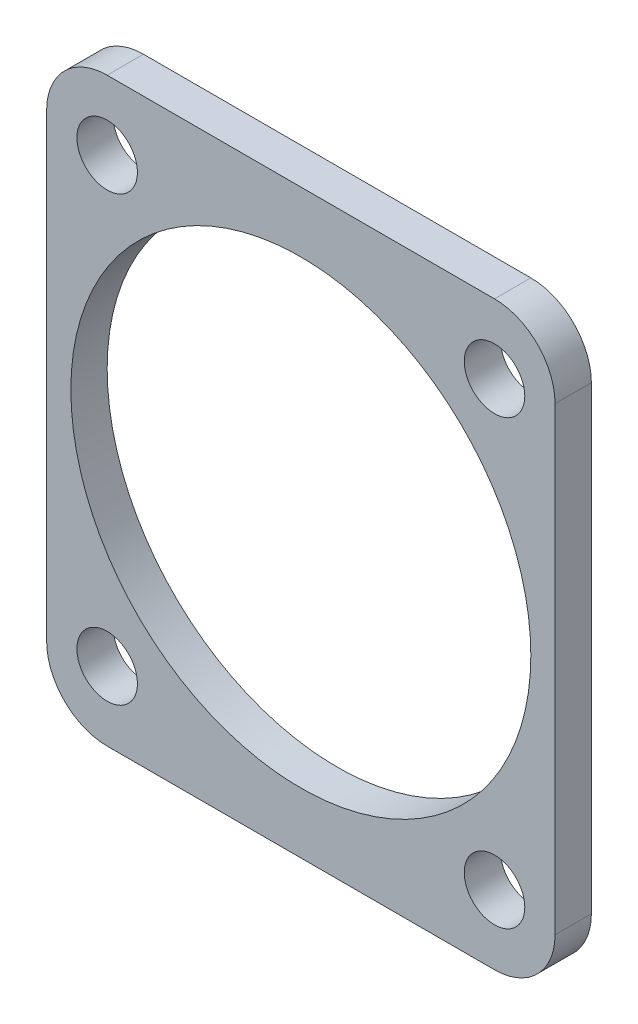
ISO-10303-21;
HEADER;
FILE_DESCRIPTION(('STEP AP214'),'2;1');
FILE_NAME('part.step','',(''),(''),'','','');
FILE_SCHEMA(('AUTOMOTIVE_DESIGN { 1 0 10303 214 1 1 1 1 }'));
ENDSEC;
DATA;
#1=APPLICATION_CONTEXT('core data for automotive mechanical design processes');
#2=APPLICATION_PROTOCOL_DEFINITION('international standard','automotive_design',2000,#1);
#3=PRODUCT_CONTEXT('',#1,'mechanical');
#4=PRODUCT('Part','Part','',(#3));
#5=PRODUCT_RELATED_PRODUCT_CATEGORY('part','',(#4));
#6=PRODUCT_DEFINITION_FORMATION('','',#4);
#7=PRODUCT_DEFINITION_CONTEXT('part definition',#1,'design');
#8=PRODUCT_DEFINITION('design','',#6,#7);
#9=PRODUCT_DEFINITION_SHAPE('','',#8);
#10=(LENGTH_UNIT() NAMED_UNIT(*) SI_UNIT(.MILLI.,.METRE.));
#11=(NAMED_UNIT(*) PLANE_ANGLE_UNIT() SI_UNIT($,.RADIAN.));
#12=(NAMED_UNIT(*) SI_UNIT($,.STERADIAN.) SOLID_ANGLE_UNIT());
#13=UNCERTAINTY_MEASURE_WITH_UNIT(LENGTH_MEASURE(1.E-05),#10,'distance_accuracy_value','');
#14=(GEOMETRIC_REPRESENTATION_CONTEXT(3) GLOBAL_UNCERTAINTY_ASSIGNED_CONTEXT((#13)) GLOBAL_UNIT_ASSIGNED_CONTEXT((#10,
#11,#12)) REPRESENTATION_CONTEXT('',''));
#15=CARTESIAN_POINT('',(0.,0.,0.));
#16=DIRECTION('',(0.,0.,1.));
#17=DIRECTION('',(1.,0.,0.));
#18=AXIS2_PLACEMENT_3D('',#15,#16,#17);
#19=CARTESIAN_POINT('',(0.,0.,3.));
#20=DIRECTION('',(0.,0.,-1.));
#21=DIRECTION('',(-1.,0.,0.));
#22=AXIS2_PLACEMENT_3D('',#19,#20,#21);
#23=PLANE('',#22);
#24=DIRECTION('',(1.,0.,0.));
#25=VECTOR('',#24,1.);
#26=CARTESIAN_POINT('',(-21.,-24.,3.));
#27=LINE('',#26,#25);
#28=CARTESIAN_POINT('',(-16.,-24.,3.));
#29=VERTEX_POINT('',#28);
#30=CARTESIAN_POINT('',(16.,-24.,3.));
#31=VERTEX_POINT('',#30);
#32=EDGE_CURVE('E152',#29,#31,#27,.T.);
#33=ORIENTED_EDGE('',*,*,#32,.T.);
#34=CARTESIAN_POINT('',(16.,-19.,3.));
#35=DIRECTION('',(0.,0.,-1.));
#36=DIRECTION('',(-1.,0.,0.));
#37=AXIS2_PLACEMENT_3D('',#34,#35,#36);
#38=CIRCLE('',#37,5.);
#39=CARTESIAN_POINT('',(21.,-19.,3.));
#40=VERTEX_POINT('',#39);
#41=EDGE_CURVE('E182',#31,#40,#38,.F.);
#42=ORIENTED_EDGE('',*,*,#41,.T.);
#43=DIRECTION('',(0.,1.,0.));
#44=VECTOR('',#43,1.);
#45=CARTESIAN_POINT('',(21.,-24.,3.));
#46=LINE('',#45,#44);
#47=CARTESIAN_POINT('',(21.,19.,3.));
#48=VERTEX_POINT('',#47);
#49=EDGE_CURVE('E131',#40,#48,#46,.T.);
#50=ORIENTED_EDGE('',*,*,#49,.T.);
#51=CARTESIAN_POINT('',(16.,19.,3.));
#52=DIRECTION('',(0.,0.,-1.));
#53=DIRECTION('',(-1.,0.,0.));
#54=AXIS2_PLACEMENT_3D('',#51,#52,#53);
#55=CIRCLE('',#54,5.);
#56=CARTESIAN_POINT('',(16.,24.,3.));
#57=VERTEX_POINT('',#56);
#58=EDGE_CURVE('E174',#48,#57,#55,.F.);
#59=ORIENTED_EDGE('',*,*,#58,.T.);
#60=DIRECTION('',(-1.,0.,0.));
#61=VECTOR('',#60,1.);
#62=CARTESIAN_POINT('',(-21.,24.,3.));
#63=LINE('',#62,#61);
#64=CARTESIAN_POINT('',(-16.,24.,3.));
#65=VERTEX_POINT('',#64);
#66=EDGE_CURVE('E197',#57,#65,#63,.T.);
#67=ORIENTED_EDGE('',*,*,#66,.T.);
#68=CARTESIAN_POINT('',(-16.,19.,3.));
#69=DIRECTION('',(0.,0.,-1.));
#70=DIRECTION('',(-1.,0.,0.));
#71=AXIS2_PLACEMENT_3D('',#68,#69,#70);
#72=CIRCLE('',#71,5.);
#73=CARTESIAN_POINT('',(-21.,19.,3.));
#74=VERTEX_POINT('',#73);
#75=EDGE_CURVE('E66',#65,#74,#72,.F.);
#76=ORIENTED_EDGE('',*,*,#75,.T.);
#77=DIRECTION('',(0.,-1.,0.));
#78=VECTOR('',#77,1.);
#79=CARTESIAN_POINT('',(-21.,-24.,3.));
#80=LINE('',#79,#78);
#81=CARTESIAN_POINT('',(-21.,-19.,3.));
#82=VERTEX_POINT('',#81);
#83=EDGE_CURVE('E205',#74,#82,#80,.T.);
#84=ORIENTED_EDGE('',*,*,#83,.T.);
#85=CARTESIAN_POINT('',(-16.,-19.,3.));
#86=DIRECTION('',(0.,0.,-1.));
#87=DIRECTION('',(-1.,0.,0.));
#88=AXIS2_PLACEMENT_3D('',#85,#86,#87);
#89=CIRCLE('',#88,5.);
#90=EDGE_CURVE('E179',#82,#29,#89,.F.);
#91=ORIENTED_EDGE('',*,*,#90,.T.);
#92=EDGE_LOOP('',(#33,#42,#50,#59,#67,#76,#84,#91));
#93=FACE_BOUND('',#92,.T.);
#94=CARTESIAN_POINT('',(0.,0.,3.));
#95=DIRECTION('',(0.,0.,1.));
#96=DIRECTION('',(1.,0.,0.));
#97=AXIS2_PLACEMENT_3D('',#94,#95,#96);
#98=CIRCLE('',#97,19.);
#99=CARTESIAN_POINT('',(19.,0.,3.));
#100=VERTEX_POINT('',#99);
#101=EDGE_CURVE('E141',#100,#100,#98,.T.);
#102=ORIENTED_EDGE('',*,*,#101,.F.);
#103=EDGE_LOOP('',(#102));
#104=FACE_BOUND('',#103,.T.);
#105=CARTESIAN_POINT('',(-16.,18.2857142857143,3.));
#106=DIRECTION('',(0.,0.,1.));
#107=DIRECTION('',(1.,0.,0.));
#108=AXIS2_PLACEMENT_3D('',#105,#106,#107);
#109=CIRCLE('',#108,2.5);
#110=CARTESIAN_POINT('',(-13.5,18.2857142857143,3.));
#111=VERTEX_POINT('',#110);
#112=EDGE_CURVE('E217',#111,#111,#109,.T.);
#113=ORIENTED_EDGE('',*,*,#112,.F.);
#114=EDGE_LOOP('',(#113));
#115=FACE_BOUND('',#114,.T.);
#116=CARTESIAN_POINT('',(16.,18.2857142857143,3.));
#117=DIRECTION('',(0.,0.,1.));
#118=DIRECTION('',(1.,0.,0.));
#119=AXIS2_PLACEMENT_3D('',#116,#117,#118);
#120=CIRCLE('',#119,2.5);
#121=CARTESIAN_POINT('',(18.5,18.2857142857143,3.));
#122=VERTEX_POINT('',#121);
#123=EDGE_CURVE('E223',#122,#122,#120,.T.);
#124=ORIENTED_EDGE('',*,*,#123,.F.);
#125=EDGE_LOOP('',(#124));
#126=FACE_BOUND('',#125,.T.);
#127=CARTESIAN_POINT('',(16.,-18.2857142857143,3.));
#128=DIRECTION('',(0.,0.,1.));
#129=DIRECTION('',(1.,0.,0.));
#130=AXIS2_PLACEMENT_3D('',#127,#128,#129);
#131=CIRCLE('',#130,2.5);
#132=CARTESIAN_POINT('',(18.5,-18.2857142857143,3.));
#133=VERTEX_POINT('',#132);
#134=EDGE_CURVE('E231',#133,#133,#131,.T.);
#135=ORIENTED_EDGE('',*,*,#134,.F.);
#136=EDGE_LOOP('',(#135));
#137=FACE_BOUND('',#136,.T.);
#138=CARTESIAN_POINT('',(-16.,-18.2857142857143,3.));
#139=DIRECTION('',(0.,0.,1.));
#140=DIRECTION('',(1.,0.,0.));
#141=AXIS2_PLACEMENT_3D('',#138,#139,#140);
#142=CIRCLE('',#141,2.5);
#143=CARTESIAN_POINT('',(-13.5,-18.2857142857143,3.));
#144=VERTEX_POINT('',#143);
#145=EDGE_CURVE('E239',#144,#144,#142,.T.);
#146=ORIENTED_EDGE('',*,*,#145,.F.);
#147=EDGE_LOOP('',(#146));
#148=FACE_BOUND('',#147,.T.);
#149=ADVANCED_FACE('F43',(#93,#104,#115,#126,#137,#148),#23,.F.);
#150=CARTESIAN_POINT('',(0.,0.,0.));
#151=DIRECTION('',(0.,0.,-1.));
#152=DIRECTION('',(-1.,0.,0.));
#153=AXIS2_PLACEMENT_3D('',#150,#151,#152);
#154=PLANE('',#153);
#155=CARTESIAN_POINT('',(16.,-18.2857142857143,0.));
#156=DIRECTION('',(0.,0.,1.));
#157=DIRECTION('',(1.,0.,0.));
#158=AXIS2_PLACEMENT_3D('',#155,#156,#157);
#159=CIRCLE('',#158,2.5);
#160=CARTESIAN_POINT('',(18.5,-18.2857142857143,0.));
#161=VERTEX_POINT('',#160);
#162=EDGE_CURVE('E235',#161,#161,#159,.T.);
#163=ORIENTED_EDGE('',*,*,#162,.T.);
#164=EDGE_LOOP('',(#163));
#165=FACE_BOUND('',#164,.T.);
#166=CARTESIAN_POINT('',(-16.,18.2857142857143,0.));
#167=DIRECTION('',(0.,0.,1.));
#168=DIRECTION('',(1.,0.,0.));
#169=AXIS2_PLACEMENT_3D('',#166,#167,#168);
#170=CIRCLE('',#169,2.5);
#171=CARTESIAN_POINT('',(-13.5,18.2857142857143,0.));
#172=VERTEX_POINT('',#171);
#173=EDGE_CURVE('E219',#172,#172,#170,.T.);
#174=ORIENTED_EDGE('',*,*,#173,.T.);
#175=EDGE_LOOP('',(#174));
#176=FACE_BOUND('',#175,.T.);
#177=DIRECTION('',(0.,1.,0.));
#178=VECTOR('',#177,1.);
#179=CARTESIAN_POINT('',(21.,-24.,0.));
#180=LINE('',#179,#178);
#181=CARTESIAN_POINT('',(21.,-19.,0.));
#182=VERTEX_POINT('',#181);
#183=CARTESIAN_POINT('',(21.,19.,0.));
#184=VERTEX_POINT('',#183);
#185=EDGE_CURVE('E128',#182,#184,#180,.T.);
#186=ORIENTED_EDGE('',*,*,#185,.F.);
#187=CARTESIAN_POINT('',(16.,-19.,0.));
#188=DIRECTION('',(0.,0.,-1.));
#189=DIRECTION('',(-1.,0.,0.));
#190=AXIS2_PLACEMENT_3D('',#187,#188,#189);
#191=CIRCLE('',#190,5.);
#192=CARTESIAN_POINT('',(16.,-24.,0.));
#193=VERTEX_POINT('',#192);
#194=EDGE_CURVE('E110',#182,#193,#191,.T.);
#195=ORIENTED_EDGE('',*,*,#194,.T.);
#196=DIRECTION('',(1.,0.,0.));
#197=VECTOR('',#196,1.);
#198=CARTESIAN_POINT('',(-21.,-24.,0.));
#199=LINE('',#198,#197);
#200=CARTESIAN_POINT('',(-16.,-24.,0.));
#201=VERTEX_POINT('',#200);
#202=EDGE_CURVE('E157',#201,#193,#199,.T.);
#203=ORIENTED_EDGE('',*,*,#202,.F.);
#204=CARTESIAN_POINT('',(-16.,-19.,0.));
#205=DIRECTION('',(0.,0.,-1.));
#206=DIRECTION('',(-1.,0.,0.));
#207=AXIS2_PLACEMENT_3D('',#204,#205,#206);
#208=CIRCLE('',#207,5.);
#209=CARTESIAN_POINT('',(-21.,-19.,0.));
#210=VERTEX_POINT('',#209);
#211=EDGE_CURVE('E122',#201,#210,#208,.T.);
#212=ORIENTED_EDGE('',*,*,#211,.T.);
#213=DIRECTION('',(0.,-1.,0.));
#214=VECTOR('',#213,1.);
#215=CARTESIAN_POINT('',(-21.,-24.,0.));
#216=LINE('',#215,#214);
#217=CARTESIAN_POINT('',(-21.,19.,0.));
#218=VERTEX_POINT('',#217);
#219=EDGE_CURVE('E146',#218,#210,#216,.T.);
#220=ORIENTED_EDGE('',*,*,#219,.F.);
#221=CARTESIAN_POINT('',(-16.,19.,0.));
#222=DIRECTION('',(0.,0.,-1.));
#223=DIRECTION('',(-1.,0.,0.));
#224=AXIS2_PLACEMENT_3D('',#221,#222,#223);
#225=CIRCLE('',#224,5.);
#226=CARTESIAN_POINT('',(-16.,24.,0.));
#227=VERTEX_POINT('',#226);
#228=EDGE_CURVE('E164',#218,#227,#225,.T.);
#229=ORIENTED_EDGE('',*,*,#228,.T.);
#230=DIRECTION('',(-1.,0.,0.));
#231=VECTOR('',#230,1.);
#232=CARTESIAN_POINT('',(-21.,24.,0.));
#233=LINE('',#232,#231);
#234=CARTESIAN_POINT('',(16.,24.,0.));
#235=VERTEX_POINT('',#234);
#236=EDGE_CURVE('E140',#235,#227,#233,.T.);
#237=ORIENTED_EDGE('',*,*,#236,.F.);
#238=CARTESIAN_POINT('',(16.,19.,0.));
#239=DIRECTION('',(0.,0.,-1.));
#240=DIRECTION('',(-1.,0.,0.));
#241=AXIS2_PLACEMENT_3D('',#238,#239,#240);
#242=CIRCLE('',#241,5.);
#243=EDGE_CURVE('E133',#235,#184,#242,.T.);
#244=ORIENTED_EDGE('',*,*,#243,.T.);
#245=EDGE_LOOP('',(#186,#195,#203,#212,#220,#229,#237,#244));
#246=FACE_BOUND('',#245,.T.);
#247=CARTESIAN_POINT('',(0.,0.,0.));
#248=DIRECTION('',(0.,0.,1.));
#249=DIRECTION('',(1.,0.,0.));
#250=AXIS2_PLACEMENT_3D('',#247,#248,#249);
#251=CIRCLE('',#250,19.);
#252=CARTESIAN_POINT('',(19.,0.,0.));
#253=VERTEX_POINT('',#252);
#254=EDGE_CURVE('E149',#253,#253,#251,.T.);
#255=ORIENTED_EDGE('',*,*,#254,.T.);
#256=EDGE_LOOP('',(#255));
#257=FACE_BOUND('',#256,.T.);
#258=CARTESIAN_POINT('',(16.,18.2857142857143,0.));
#259=DIRECTION('',(0.,0.,1.));
#260=DIRECTION('',(1.,0.,0.));
#261=AXIS2_PLACEMENT_3D('',#258,#259,#260);
#262=CIRCLE('',#261,2.5);
#263=CARTESIAN_POINT('',(18.5,18.2857142857143,0.));
#264=VERTEX_POINT('',#263);
#265=EDGE_CURVE('E227',#264,#264,#262,.T.);
#266=ORIENTED_EDGE('',*,*,#265,.T.);
#267=EDGE_LOOP('',(#266));
#268=FACE_BOUND('',#267,.T.);
#269=CARTESIAN_POINT('',(-16.,-18.2857142857143,0.));
#270=DIRECTION('',(0.,0.,1.));
#271=DIRECTION('',(1.,0.,0.));
#272=AXIS2_PLACEMENT_3D('',#269,#270,#271);
#273=CIRCLE('',#272,2.5);
#274=CARTESIAN_POINT('',(-13.5,-18.2857142857143,0.));
#275=VERTEX_POINT('',#274);
#276=EDGE_CURVE('E243',#275,#275,#273,.T.);
#277=ORIENTED_EDGE('',*,*,#276,.T.);
#278=EDGE_LOOP('',(#277));
#279=FACE_BOUND('',#278,.T.);
#280=ADVANCED_FACE('F136',(#165,#176,#246,#257,#268,#279),#154,.T.);
#281=CARTESIAN_POINT('',(21.,-24.,3.));
#282=DIRECTION('',(-1.,0.,0.));
#283=DIRECTION('',(0.,0.,1.));
#284=AXIS2_PLACEMENT_3D('',#281,#282,#283);
#285=PLANE('',#284);
#286=ORIENTED_EDGE('',*,*,#49,.F.);
#287=DIRECTION('',(0.,0.,-1.));
#288=VECTOR('',#287,1.);
#289=CARTESIAN_POINT('',(21.,-19.,3.));
#290=LINE('',#289,#288);
#291=EDGE_CURVE('E114',#40,#182,#290,.T.);
#292=ORIENTED_EDGE('',*,*,#291,.T.);
#293=ORIENTED_EDGE('',*,*,#185,.T.);
#294=DIRECTION('',(0.,0.,-1.));
#295=VECTOR('',#294,1.);
#296=CARTESIAN_POINT('',(21.,19.,3.));
#297=LINE('',#296,#295);
#298=EDGE_CURVE('E134',#184,#48,#297,.F.);
#299=ORIENTED_EDGE('',*,*,#298,.T.);
#300=EDGE_LOOP('',(#286,#292,#293,#299));
#301=FACE_BOUND('',#300,.T.);
#302=ADVANCED_FACE('F127',(#301),#285,.F.);
#303=CARTESIAN_POINT('',(-21.,24.,3.));
#304=DIRECTION('',(0.,-1.,0.));
#305=DIRECTION('',(0.,0.,-1.));
#306=AXIS2_PLACEMENT_3D('',#303,#304,#305);
#307=PLANE('',#306);
#308=ORIENTED_EDGE('',*,*,#236,.T.);
#309=DIRECTION('',(0.,0.,-1.));
#310=VECTOR('',#309,1.);
#311=CARTESIAN_POINT('',(-16.,24.,3.));
#312=LINE('',#311,#310);
#313=EDGE_CURVE('E11',#227,#65,#312,.F.);
#314=ORIENTED_EDGE('',*,*,#313,.T.);
#315=ORIENTED_EDGE('',*,*,#66,.F.);
#316=DIRECTION('',(0.,0.,-1.));
#317=VECTOR('',#316,1.);
#318=CARTESIAN_POINT('',(16.,24.,3.));
#319=LINE('',#318,#317);
#320=EDGE_CURVE('E52',#57,#235,#319,.T.);
#321=ORIENTED_EDGE('',*,*,#320,.T.);
#322=EDGE_LOOP('',(#308,#314,#315,#321));
#323=FACE_BOUND('',#322,.T.);
#324=ADVANCED_FACE('F195',(#323),#307,.F.);
#325=CARTESIAN_POINT('',(-21.,-24.,3.));
#326=DIRECTION('',(1.,0.,0.));
#327=DIRECTION('',(0.,0.,-1.));
#328=AXIS2_PLACEMENT_3D('',#325,#326,#327);
#329=PLANE('',#328);
#330=ORIENTED_EDGE('',*,*,#219,.T.);
#331=DIRECTION('',(0.,0.,-1.));
#332=VECTOR('',#331,1.);
#333=CARTESIAN_POINT('',(-21.,-19.,3.));
#334=LINE('',#333,#332);
#335=EDGE_CURVE('E59',#210,#82,#334,.F.);
#336=ORIENTED_EDGE('',*,*,#335,.T.);
#337=ORIENTED_EDGE('',*,*,#83,.F.);
#338=DIRECTION('',(0.,0.,-1.));
#339=VECTOR('',#338,1.);
#340=CARTESIAN_POINT('',(-21.,19.,3.));
#341=LINE('',#340,#339);
#342=EDGE_CURVE('E185',#74,#218,#341,.T.);
#343=ORIENTED_EDGE('',*,*,#342,.T.);
#344=EDGE_LOOP('',(#330,#336,#337,#343));
#345=FACE_BOUND('',#344,.T.);
#346=ADVANCED_FACE('F204',(#345),#329,.F.);
#347=CARTESIAN_POINT('',(-21.,-24.,3.));
#348=DIRECTION('',(0.,1.,0.));
#349=DIRECTION('',(0.,0.,1.));
#350=AXIS2_PLACEMENT_3D('',#347,#348,#349);
#351=PLANE('',#350);
#352=ORIENTED_EDGE('',*,*,#202,.T.);
#353=DIRECTION('',(0.,0.,-1.));
#354=VECTOR('',#353,1.);
#355=CARTESIAN_POINT('',(16.,-24.,3.));
#356=LINE('',#355,#354);
#357=EDGE_CURVE('E115',#193,#31,#356,.F.);
#358=ORIENTED_EDGE('',*,*,#357,.T.);
#359=ORIENTED_EDGE('',*,*,#32,.F.);
#360=DIRECTION('',(0.,0.,-1.));
#361=VECTOR('',#360,1.);
#362=CARTESIAN_POINT('',(-16.,-24.,3.));
#363=LINE('',#362,#361);
#364=EDGE_CURVE('E121',#29,#201,#363,.T.);
#365=ORIENTED_EDGE('',*,*,#364,.T.);
#366=EDGE_LOOP('',(#352,#358,#359,#365));
#367=FACE_BOUND('',#366,.T.);
#368=ADVANCED_FACE('F266',(#367),#351,.F.);
#369=CARTESIAN_POINT('',(0.,0.,3.));
#370=DIRECTION('',(0.,0.,-1.));
#371=DIRECTION('',(-1.,0.,0.));
#372=AXIS2_PLACEMENT_3D('',#369,#370,#371);
#373=CYLINDRICAL_SURFACE('',#372,19.);
#374=ORIENTED_EDGE('',*,*,#101,.T.);
#375=EDGE_LOOP('',(#374));
#376=FACE_BOUND('',#375,.T.);
#377=ORIENTED_EDGE('',*,*,#254,.F.);
#378=EDGE_LOOP('',(#377));
#379=FACE_BOUND('',#378,.T.);
#380=ADVANCED_FACE('F263',(#376,#379),#373,.F.);
#381=CARTESIAN_POINT('',(-16.,18.2857142857143,3.));
#382=DIRECTION('',(0.,0.,-1.));
#383=DIRECTION('',(-1.,0.,0.));
#384=AXIS2_PLACEMENT_3D('',#381,#382,#383);
#385=CYLINDRICAL_SURFACE('',#384,2.5);
#386=ORIENTED_EDGE('',*,*,#112,.T.);
#387=EDGE_LOOP('',(#386));
#388=FACE_BOUND('',#387,.T.);
#389=ORIENTED_EDGE('',*,*,#173,.F.);
#390=EDGE_LOOP('',(#389));
#391=FACE_BOUND('',#390,.T.);
#392=ADVANCED_FACE('F381',(#388,#391),#385,.F.);
#393=CARTESIAN_POINT('',(16.,18.2857142857143,3.));
#394=DIRECTION('',(0.,0.,-1.));
#395=DIRECTION('',(-1.,0.,0.));
#396=AXIS2_PLACEMENT_3D('',#393,#394,#395);
#397=CYLINDRICAL_SURFACE('',#396,2.5);
#398=ORIENTED_EDGE('',*,*,#123,.T.);
#399=EDGE_LOOP('',(#398));
#400=FACE_BOUND('',#399,.T.);
#401=ORIENTED_EDGE('',*,*,#265,.F.);
#402=EDGE_LOOP('',(#401));
#403=FACE_BOUND('',#402,.T.);
#404=ADVANCED_FACE('F370',(#400,#403),#397,.F.);
#405=CARTESIAN_POINT('',(16.,-18.2857142857143,3.));
#406=DIRECTION('',(0.,0.,-1.));
#407=DIRECTION('',(-1.,0.,0.));
#408=AXIS2_PLACEMENT_3D('',#405,#406,#407);
#409=CYLINDRICAL_SURFACE('',#408,2.5);
#410=ORIENTED_EDGE('',*,*,#134,.T.);
#411=EDGE_LOOP('',(#410));
#412=FACE_BOUND('',#411,.T.);
#413=ORIENTED_EDGE('',*,*,#162,.F.);
#414=EDGE_LOOP('',(#413));
#415=FACE_BOUND('',#414,.T.);
#416=ADVANCED_FACE('F360',(#412,#415),#409,.F.);
#417=CARTESIAN_POINT('',(-16.,-18.2857142857143,3.));
#418=DIRECTION('',(0.,0.,-1.));
#419=DIRECTION('',(-1.,0.,0.));
#420=AXIS2_PLACEMENT_3D('',#417,#418,#419);
#421=CYLINDRICAL_SURFACE('',#420,2.5);
#422=ORIENTED_EDGE('',*,*,#145,.T.);
#423=EDGE_LOOP('',(#422));
#424=FACE_BOUND('',#423,.T.);
#425=ORIENTED_EDGE('',*,*,#276,.F.);
#426=EDGE_LOOP('',(#425));
#427=FACE_BOUND('',#426,.T.);
#428=ADVANCED_FACE('F251',(#424,#427),#421,.F.);
#429=CARTESIAN_POINT('',(16.,-19.,3.));
#430=DIRECTION('',(0.,0.,-1.));
#431=DIRECTION('',(-1.,0.,0.));
#432=AXIS2_PLACEMENT_3D('',#429,#430,#431);
#433=CYLINDRICAL_SURFACE('',#432,5.);
#434=ORIENTED_EDGE('',*,*,#41,.F.);
#435=ORIENTED_EDGE('',*,*,#357,.F.);
#436=ORIENTED_EDGE('',*,*,#194,.F.);
#437=ORIENTED_EDGE('',*,*,#291,.F.);
#438=EDGE_LOOP('',(#434,#435,#436,#437));
#439=FACE_BOUND('',#438,.T.);
#440=ADVANCED_FACE('F113',(#439),#433,.T.);
#441=CARTESIAN_POINT('',(-16.,-19.,3.));
#442=DIRECTION('',(0.,0.,-1.));
#443=DIRECTION('',(-1.,0.,0.));
#444=AXIS2_PLACEMENT_3D('',#441,#442,#443);
#445=CYLINDRICAL_SURFACE('',#444,5.);
#446=ORIENTED_EDGE('',*,*,#90,.F.);
#447=ORIENTED_EDGE('',*,*,#335,.F.);
#448=ORIENTED_EDGE('',*,*,#211,.F.);
#449=ORIENTED_EDGE('',*,*,#364,.F.);
#450=EDGE_LOOP('',(#446,#447,#448,#449));
#451=FACE_BOUND('',#450,.T.);
#452=ADVANCED_FACE('F278',(#451),#445,.T.);
#453=CARTESIAN_POINT('',(-16.,19.,3.));
#454=DIRECTION('',(0.,0.,-1.));
#455=DIRECTION('',(-1.,0.,0.));
#456=AXIS2_PLACEMENT_3D('',#453,#454,#455);
#457=CYLINDRICAL_SURFACE('',#456,5.);
#458=ORIENTED_EDGE('',*,*,#75,.F.);
#459=ORIENTED_EDGE('',*,*,#313,.F.);
#460=ORIENTED_EDGE('',*,*,#228,.F.);
#461=ORIENTED_EDGE('',*,*,#342,.F.);
#462=EDGE_LOOP('',(#458,#459,#460,#461));
#463=FACE_BOUND('',#462,.T.);
#464=ADVANCED_FACE('F203',(#463),#457,.T.);
#465=CARTESIAN_POINT('',(16.,19.,3.));
#466=DIRECTION('',(0.,0.,-1.));
#467=DIRECTION('',(-1.,0.,0.));
#468=AXIS2_PLACEMENT_3D('',#465,#466,#467);
#469=CYLINDRICAL_SURFACE('',#468,5.);
#470=ORIENTED_EDGE('',*,*,#58,.F.);
#471=ORIENTED_EDGE('',*,*,#298,.F.);
#472=ORIENTED_EDGE('',*,*,#243,.F.);
#473=ORIENTED_EDGE('',*,*,#320,.F.);
#474=EDGE_LOOP('',(#470,#471,#472,#473));
#475=FACE_BOUND('',#474,.T.);
#476=ADVANCED_FACE('F45',(#475),#469,.T.);
#477=CLOSED_SHELL('',(#149,#280,#302,#324,#346,#368,#380,#392,#404,#416,#428,#440,#452,#464,#476));
#478=MANIFOLD_SOLID_BREP('B2',#477);
#479=ADVANCED_BREP_SHAPE_REPRESENTATION('',(#18,#478),#14);
#480=SHAPE_DEFINITION_REPRESENTATION(#9,#479);
ENDSEC;
END-ISO-10303-21;
